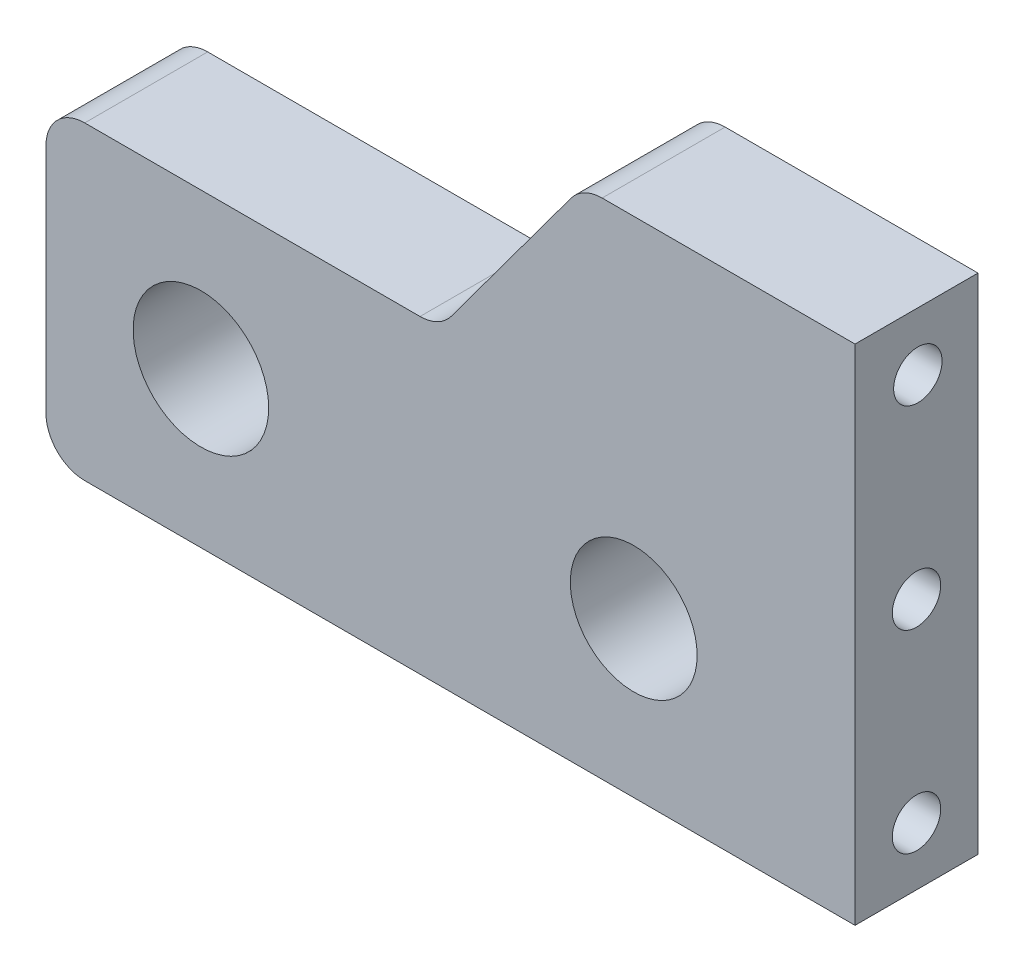
ISO-10303-21;
HEADER;
FILE_DESCRIPTION(('STEP AP214'),'2;1');
FILE_NAME('part.step','',(''),(''),'','','');
FILE_SCHEMA(('AUTOMOTIVE_DESIGN { 1 0 10303 214 1 1 1 1 }'));
ENDSEC;
DATA;
#1=APPLICATION_CONTEXT('core data for automotive mechanical design processes');
#2=APPLICATION_PROTOCOL_DEFINITION('international standard','automotive_design',2000,#1);
#3=PRODUCT_CONTEXT('',#1,'mechanical');
#4=PRODUCT('Part','Part','',(#3));
#5=PRODUCT_RELATED_PRODUCT_CATEGORY('part','',(#4));
#6=PRODUCT_DEFINITION_FORMATION('','',#4);
#7=PRODUCT_DEFINITION_CONTEXT('part definition',#1,'design');
#8=PRODUCT_DEFINITION('design','',#6,#7);
#9=PRODUCT_DEFINITION_SHAPE('','',#8);
#10=(LENGTH_UNIT() NAMED_UNIT(*) SI_UNIT(.MILLI.,.METRE.));
#11=(NAMED_UNIT(*) PLANE_ANGLE_UNIT() SI_UNIT($,.RADIAN.));
#12=(NAMED_UNIT(*) SI_UNIT($,.STERADIAN.) SOLID_ANGLE_UNIT());
#13=UNCERTAINTY_MEASURE_WITH_UNIT(LENGTH_MEASURE(1.E-05),#10,'distance_accuracy_value','');
#14=(GEOMETRIC_REPRESENTATION_CONTEXT(3) GLOBAL_UNCERTAINTY_ASSIGNED_CONTEXT((#13)) GLOBAL_UNIT_ASSIGNED_CONTEXT((#10,
#11,#12)) REPRESENTATION_CONTEXT('',''));
#15=CARTESIAN_POINT('',(0.,0.,0.));
#16=DIRECTION('',(0.,0.,1.));
#17=DIRECTION('',(1.,0.,0.));
#18=AXIS2_PLACEMENT_3D('',#15,#16,#17);
#19=CARTESIAN_POINT('',(0.,0.,6.35));
#20=DIRECTION('',(-1.,0.,0.));
#21=DIRECTION('',(0.,-1.,0.));
#22=AXIS2_PLACEMENT_3D('',#19,#20,#21);
#23=PLANE('',#22);
#24=DIRECTION('',(0.,1.,0.));
#25=VECTOR('',#24,1.);
#26=CARTESIAN_POINT('',(0.,0.,6.35));
#27=LINE('',#26,#25);
#28=CARTESIAN_POINT('',(0.,2.,6.35));
#29=VERTEX_POINT('',#28);
#30=CARTESIAN_POINT('',(0.,14.,6.35));
#31=VERTEX_POINT('',#30);
#32=EDGE_CURVE('E205',#29,#31,#27,.T.);
#33=ORIENTED_EDGE('',*,*,#32,.T.);
#34=DIRECTION('',(0.,0.,-1.));
#35=VECTOR('',#34,1.);
#36=CARTESIAN_POINT('',(0.,14.,6.35));
#37=LINE('',#36,#35);
#38=CARTESIAN_POINT('',(0.,14.,0.));
#39=VERTEX_POINT('',#38);
#40=EDGE_CURVE('E232',#31,#39,#37,.T.);
#41=ORIENTED_EDGE('',*,*,#40,.T.);
#42=DIRECTION('',(0.,1.,0.));
#43=VECTOR('',#42,1.);
#44=CARTESIAN_POINT('',(0.,0.,0.));
#45=LINE('',#44,#43);
#46=CARTESIAN_POINT('',(0.,2.,0.));
#47=VERTEX_POINT('',#46);
#48=EDGE_CURVE('E193',#47,#39,#45,.T.);
#49=ORIENTED_EDGE('',*,*,#48,.F.);
#50=DIRECTION('',(0.,0.,-1.));
#51=VECTOR('',#50,1.);
#52=CARTESIAN_POINT('',(0.,2.,6.35));
#53=LINE('',#52,#51);
#54=EDGE_CURVE('E229',#47,#29,#53,.F.);
#55=ORIENTED_EDGE('',*,*,#54,.T.);
#56=EDGE_LOOP('',(#33,#41,#49,#55));
#57=FACE_BOUND('',#56,.T.);
#58=ADVANCED_FACE('F60',(#57),#23,.T.);
#59=CARTESIAN_POINT('',(0.,0.,6.35));
#60=DIRECTION('',(0.,1.,0.));
#61=DIRECTION('',(-1.,0.,0.));
#62=AXIS2_PLACEMENT_3D('',#59,#60,#61);
#63=PLANE('',#62);
#64=DIRECTION('',(1.,0.,0.));
#65=VECTOR('',#64,1.);
#66=CARTESIAN_POINT('',(0.,0.,6.35));
#67=LINE('',#66,#65);
#68=CARTESIAN_POINT('',(2.,0.,6.35));
#69=VERTEX_POINT('',#68);
#70=CARTESIAN_POINT('',(41.782,0.,6.35));
#71=VERTEX_POINT('',#70);
#72=EDGE_CURVE('E216',#69,#71,#67,.T.);
#73=ORIENTED_EDGE('',*,*,#72,.F.);
#74=DIRECTION('',(0.,0.,-1.));
#75=VECTOR('',#74,1.);
#76=CARTESIAN_POINT('',(2.,0.,0.));
#77=LINE('',#76,#75);
#78=CARTESIAN_POINT('',(2.,0.,0.));
#79=VERTEX_POINT('',#78);
#80=EDGE_CURVE('E251',#69,#79,#77,.T.);
#81=ORIENTED_EDGE('',*,*,#80,.T.);
#82=DIRECTION('',(1.,0.,0.));
#83=VECTOR('',#82,1.);
#84=CARTESIAN_POINT('',(0.,0.,0.));
#85=LINE('',#84,#83);
#86=CARTESIAN_POINT('',(41.782,0.,0.));
#87=VERTEX_POINT('',#86);
#88=EDGE_CURVE('E151',#79,#87,#85,.T.);
#89=ORIENTED_EDGE('',*,*,#88,.T.);
#90=DIRECTION('',(0.,0.,-1.));
#91=VECTOR('',#90,1.);
#92=CARTESIAN_POINT('',(41.782,0.,6.35));
#93=LINE('',#92,#91);
#94=EDGE_CURVE('E148',#71,#87,#93,.T.);
#95=ORIENTED_EDGE('',*,*,#94,.F.);
#96=EDGE_LOOP('',(#73,#81,#89,#95));
#97=FACE_BOUND('',#96,.T.);
#98=ADVANCED_FACE('F311',(#97),#63,.F.);
#99=CARTESIAN_POINT('',(41.782,0.,6.35));
#100=DIRECTION('',(-1.,0.,0.));
#101=DIRECTION('',(0.,0.,1.));
#102=AXIS2_PLACEMENT_3D('',#99,#100,#101);
#103=PLANE('',#102);
#104=CARTESIAN_POINT('',(41.782,23.,3.10572404048079));
#105=DIRECTION('',(1.,0.,0.));
#106=DIRECTION('',(0.,0.,-1.));
#107=AXIS2_PLACEMENT_3D('',#104,#105,#106);
#108=CIRCLE('',#107,1.25);
#109=CARTESIAN_POINT('',(41.782,23.,1.85572404048079));
#110=VERTEX_POINT('',#109);
#111=EDGE_CURVE('E293',#110,#110,#108,.T.);
#112=ORIENTED_EDGE('',*,*,#111,.F.);
#113=EDGE_LOOP('',(#112));
#114=FACE_BOUND('',#113,.T.);
#115=CARTESIAN_POINT('',(41.782,13.,3.175));
#116=DIRECTION('',(1.,0.,0.));
#117=DIRECTION('',(0.,0.,-1.));
#118=AXIS2_PLACEMENT_3D('',#115,#116,#117);
#119=CIRCLE('',#118,1.25);
#120=CARTESIAN_POINT('',(41.782,13.,1.925));
#121=VERTEX_POINT('',#120);
#122=EDGE_CURVE('E176',#121,#121,#119,.T.);
#123=ORIENTED_EDGE('',*,*,#122,.F.);
#124=EDGE_LOOP('',(#123));
#125=FACE_BOUND('',#124,.T.);
#126=CARTESIAN_POINT('',(41.782,3.,3.175));
#127=DIRECTION('',(1.,0.,0.));
#128=DIRECTION('',(0.,0.,-1.));
#129=AXIS2_PLACEMENT_3D('',#126,#127,#128);
#130=CIRCLE('',#129,1.25);
#131=CARTESIAN_POINT('',(41.782,3.,1.925));
#132=VERTEX_POINT('',#131);
#133=EDGE_CURVE('E184',#132,#132,#130,.T.);
#134=ORIENTED_EDGE('',*,*,#133,.F.);
#135=EDGE_LOOP('',(#134));
#136=FACE_BOUND('',#135,.T.);
#137=DIRECTION('',(0.,1.,0.));
#138=VECTOR('',#137,1.);
#139=CARTESIAN_POINT('',(41.782,0.,0.));
#140=LINE('',#139,#138);
#141=CARTESIAN_POINT('',(41.782,26.,0.));
#142=VERTEX_POINT('',#141);
#143=EDGE_CURVE('E141',#87,#142,#140,.T.);
#144=ORIENTED_EDGE('',*,*,#143,.T.);
#145=DIRECTION('',(0.,0.,1.));
#146=VECTOR('',#145,1.);
#147=CARTESIAN_POINT('',(41.782,26.,0.));
#148=LINE('',#147,#146);
#149=CARTESIAN_POINT('',(41.782,26.,6.35));
#150=VERTEX_POINT('',#149);
#151=EDGE_CURVE('E145',#142,#150,#148,.T.);
#152=ORIENTED_EDGE('',*,*,#151,.T.);
#153=DIRECTION('',(0.,1.,0.));
#154=VECTOR('',#153,1.);
#155=CARTESIAN_POINT('',(41.782,0.,6.35));
#156=LINE('',#155,#154);
#157=EDGE_CURVE('E213',#71,#150,#156,.T.);
#158=ORIENTED_EDGE('',*,*,#157,.F.);
#159=ORIENTED_EDGE('',*,*,#94,.T.);
#160=EDGE_LOOP('',(#144,#152,#158,#159));
#161=FACE_BOUND('',#160,.T.);
#162=ADVANCED_FACE('F143',(#114,#125,#136,#161),#103,.F.);
#163=CARTESIAN_POINT('',(0.,16.,6.35));
#164=DIRECTION('',(0.,1.,0.));
#165=DIRECTION('',(-1.,0.,0.));
#166=AXIS2_PLACEMENT_3D('',#163,#164,#165);
#167=PLANE('',#166);
#168=DIRECTION('',(1.,0.,0.));
#169=VECTOR('',#168,1.);
#170=CARTESIAN_POINT('',(0.,16.,6.35));
#171=LINE('',#170,#169);
#172=CARTESIAN_POINT('',(2.00000000000001,16.,6.35));
#173=VERTEX_POINT('',#172);
#174=CARTESIAN_POINT('',(19.3170754387709,16.,6.35));
#175=VERTEX_POINT('',#174);
#176=EDGE_CURVE('E209',#173,#175,#171,.T.);
#177=ORIENTED_EDGE('',*,*,#176,.T.);
#178=DIRECTION('',(0.,0.,1.));
#179=VECTOR('',#178,1.);
#180=CARTESIAN_POINT('',(19.3170754387709,16.,0.));
#181=LINE('',#180,#179);
#182=CARTESIAN_POINT('',(19.3170754387709,16.,0.));
#183=VERTEX_POINT('',#182);
#184=EDGE_CURVE('E262',#175,#183,#181,.F.);
#185=ORIENTED_EDGE('',*,*,#184,.T.);
#186=DIRECTION('',(1.,0.,0.));
#187=VECTOR('',#186,1.);
#188=CARTESIAN_POINT('',(0.,16.,0.));
#189=LINE('',#188,#187);
#190=CARTESIAN_POINT('',(2.00000000000001,16.,0.));
#191=VERTEX_POINT('',#190);
#192=EDGE_CURVE('E152',#191,#183,#189,.T.);
#193=ORIENTED_EDGE('',*,*,#192,.F.);
#194=DIRECTION('',(0.,0.,-1.));
#195=VECTOR('',#194,1.);
#196=CARTESIAN_POINT('',(2.00000000000001,16.,6.35));
#197=LINE('',#196,#195);
#198=EDGE_CURVE('E242',#191,#173,#197,.F.);
#199=ORIENTED_EDGE('',*,*,#198,.T.);
#200=EDGE_LOOP('',(#177,#185,#193,#199));
#201=FACE_BOUND('',#200,.T.);
#202=ADVANCED_FACE('F282',(#201),#167,.T.);
#203=CARTESIAN_POINT('',(0.,0.,6.35));
#204=DIRECTION('',(0.,0.,-1.));
#205=DIRECTION('',(-1.,0.,0.));
#206=AXIS2_PLACEMENT_3D('',#203,#204,#205);
#207=PLANE('',#206);
#208=CARTESIAN_POINT('',(8.,8.,6.35));
#209=DIRECTION('',(0.,0.,1.));
#210=DIRECTION('',(1.,0.,0.));
#211=AXIS2_PLACEMENT_3D('',#208,#209,#210);
#212=CIRCLE('',#211,3.5);
#213=CARTESIAN_POINT('',(11.5,8.,6.35));
#214=VERTEX_POINT('',#213);
#215=EDGE_CURVE('E189',#214,#214,#212,.T.);
#216=ORIENTED_EDGE('',*,*,#215,.F.);
#217=EDGE_LOOP('',(#216));
#218=FACE_BOUND('',#217,.T.);
#219=CARTESIAN_POINT('',(30.352,8.,6.35));
#220=DIRECTION('',(0.,0.,1.));
#221=DIRECTION('',(1.,0.,0.));
#222=AXIS2_PLACEMENT_3D('',#219,#220,#221);
#223=CIRCLE('',#222,3.275);
#224=CARTESIAN_POINT('',(33.627,8.,6.35));
#225=VERTEX_POINT('',#224);
#226=EDGE_CURVE('E175',#225,#225,#223,.T.);
#227=ORIENTED_EDGE('',*,*,#226,.F.);
#228=EDGE_LOOP('',(#227));
#229=FACE_BOUND('',#228,.T.);
#230=DIRECTION('',(-1.,0.,0.));
#231=VECTOR('',#230,1.);
#232=CARTESIAN_POINT('',(41.782,26.,6.35));
#233=LINE('',#232,#231);
#234=CARTESIAN_POINT('',(28.7212493815809,26.,6.35));
#235=VERTEX_POINT('',#234);
#236=EDGE_CURVE('E158',#150,#235,#233,.T.);
#237=ORIENTED_EDGE('',*,*,#236,.T.);
#238=CARTESIAN_POINT('',(28.7212493815809,24.,6.35));
#239=DIRECTION('',(0.,0.,-1.));
#240=DIRECTION('',(-1.,0.,0.));
#241=AXIS2_PLACEMENT_3D('',#238,#239,#240);
#242=CIRCLE('',#241,2.);
#243=CARTESIAN_POINT('',(27.112470955428,25.1882053591636,6.35));
#244=VERTEX_POINT('',#243);
#245=EDGE_CURVE('E84',#235,#244,#242,.F.);
#246=ORIENTED_EDGE('',*,*,#245,.T.);
#247=DIRECTION('',(-0.594102679581803,-0.804389213076432,0.));
#248=VECTOR('',#247,1.);
#249=CARTESIAN_POINT('',(5.50572150582795,-4.06639453447363,6.35));
#250=LINE('',#249,#248);
#251=CARTESIAN_POINT('',(20.9258538649237,16.8117946408364,6.35));
#252=VERTEX_POINT('',#251);
#253=EDGE_CURVE('E160',#244,#252,#250,.T.);
#254=ORIENTED_EDGE('',*,*,#253,.T.);
#255=CARTESIAN_POINT('',(19.3170754387709,18.,6.35));
#256=DIRECTION('',(0.,0.,-1.));
#257=DIRECTION('',(-1.,0.,0.));
#258=AXIS2_PLACEMENT_3D('',#255,#256,#257);
#259=CIRCLE('',#258,2.);
#260=EDGE_CURVE('E69',#252,#175,#259,.T.);
#261=ORIENTED_EDGE('',*,*,#260,.T.);
#262=ORIENTED_EDGE('',*,*,#176,.F.);
#263=CARTESIAN_POINT('',(2.,14.,6.35));
#264=DIRECTION('',(0.,0.,-1.));
#265=DIRECTION('',(-1.,0.,0.));
#266=AXIS2_PLACEMENT_3D('',#263,#264,#265);
#267=CIRCLE('',#266,2.);
#268=EDGE_CURVE('E248',#173,#31,#267,.F.);
#269=ORIENTED_EDGE('',*,*,#268,.T.);
#270=ORIENTED_EDGE('',*,*,#32,.F.);
#271=CARTESIAN_POINT('',(2.,2.,6.35));
#272=DIRECTION('',(0.,0.,-1.));
#273=DIRECTION('',(-1.,0.,0.));
#274=AXIS2_PLACEMENT_3D('',#271,#272,#273);
#275=CIRCLE('',#274,2.);
#276=EDGE_CURVE('E245',#29,#69,#275,.F.);
#277=ORIENTED_EDGE('',*,*,#276,.T.);
#278=ORIENTED_EDGE('',*,*,#72,.T.);
#279=ORIENTED_EDGE('',*,*,#157,.T.);
#280=EDGE_LOOP('',(#237,#246,#254,#261,#262,#269,#270,#277,#278,#279));
#281=FACE_BOUND('',#280,.T.);
#282=ADVANCED_FACE('F275',(#218,#229,#281),#207,.F.);
#283=CARTESIAN_POINT('',(0.,0.,0.));
#284=DIRECTION('',(0.,0.,-1.));
#285=DIRECTION('',(-1.,0.,0.));
#286=AXIS2_PLACEMENT_3D('',#283,#284,#285);
#287=PLANE('',#286);
#288=CARTESIAN_POINT('',(8.,8.,0.));
#289=DIRECTION('',(0.,0.,1.));
#290=DIRECTION('',(1.,0.,0.));
#291=AXIS2_PLACEMENT_3D('',#288,#289,#290);
#292=CIRCLE('',#291,3.5);
#293=CARTESIAN_POINT('',(11.5,8.,0.));
#294=VERTEX_POINT('',#293);
#295=EDGE_CURVE('E194',#294,#294,#292,.T.);
#296=ORIENTED_EDGE('',*,*,#295,.T.);
#297=EDGE_LOOP('',(#296));
#298=FACE_BOUND('',#297,.T.);
#299=CARTESIAN_POINT('',(30.352,8.,0.));
#300=DIRECTION('',(0.,0.,1.));
#301=DIRECTION('',(1.,0.,0.));
#302=AXIS2_PLACEMENT_3D('',#299,#300,#301);
#303=CIRCLE('',#302,3.275);
#304=CARTESIAN_POINT('',(33.627,8.,0.));
#305=VERTEX_POINT('',#304);
#306=EDGE_CURVE('E198',#305,#305,#303,.T.);
#307=ORIENTED_EDGE('',*,*,#306,.T.);
#308=EDGE_LOOP('',(#307));
#309=FACE_BOUND('',#308,.T.);
#310=DIRECTION('',(-0.594102679581803,-0.804389213076432,0.));
#311=VECTOR('',#310,1.);
#312=CARTESIAN_POINT('',(5.50572150582795,-4.06639453447363,0.));
#313=LINE('',#312,#311);
#314=CARTESIAN_POINT('',(27.112470955428,25.1882053591636,0.));
#315=VERTEX_POINT('',#314);
#316=CARTESIAN_POINT('',(20.9258538649237,16.8117946408364,0.));
#317=VERTEX_POINT('',#316);
#318=EDGE_CURVE('E188',#315,#317,#313,.T.);
#319=ORIENTED_EDGE('',*,*,#318,.F.);
#320=CARTESIAN_POINT('',(28.7212493815809,24.,0.));
#321=DIRECTION('',(0.,0.,-1.));
#322=DIRECTION('',(-1.,0.,0.));
#323=AXIS2_PLACEMENT_3D('',#320,#321,#322);
#324=CIRCLE('',#323,2.);
#325=CARTESIAN_POINT('',(28.7212493815809,26.,0.));
#326=VERTEX_POINT('',#325);
#327=EDGE_CURVE('E76',#315,#326,#324,.T.);
#328=ORIENTED_EDGE('',*,*,#327,.T.);
#329=DIRECTION('',(-1.,0.,0.));
#330=VECTOR('',#329,1.);
#331=CARTESIAN_POINT('',(41.782,26.,0.));
#332=LINE('',#331,#330);
#333=EDGE_CURVE('E156',#142,#326,#332,.T.);
#334=ORIENTED_EDGE('',*,*,#333,.F.);
#335=ORIENTED_EDGE('',*,*,#143,.F.);
#336=ORIENTED_EDGE('',*,*,#88,.F.);
#337=CARTESIAN_POINT('',(2.,2.,0.));
#338=DIRECTION('',(0.,0.,-1.));
#339=DIRECTION('',(-1.,0.,0.));
#340=AXIS2_PLACEMENT_3D('',#337,#338,#339);
#341=CIRCLE('',#340,2.);
#342=EDGE_CURVE('E236',#79,#47,#341,.T.);
#343=ORIENTED_EDGE('',*,*,#342,.T.);
#344=ORIENTED_EDGE('',*,*,#48,.T.);
#345=CARTESIAN_POINT('',(2.,14.,0.));
#346=DIRECTION('',(0.,0.,-1.));
#347=DIRECTION('',(-1.,0.,0.));
#348=AXIS2_PLACEMENT_3D('',#345,#346,#347);
#349=CIRCLE('',#348,2.);
#350=EDGE_CURVE('E239',#39,#191,#349,.T.);
#351=ORIENTED_EDGE('',*,*,#350,.T.);
#352=ORIENTED_EDGE('',*,*,#192,.T.);
#353=CARTESIAN_POINT('',(19.3170754387709,18.,0.));
#354=DIRECTION('',(0.,0.,-1.));
#355=DIRECTION('',(-1.,0.,0.));
#356=AXIS2_PLACEMENT_3D('',#353,#354,#355);
#357=CIRCLE('',#356,2.);
#358=EDGE_CURVE('E12',#183,#317,#357,.F.);
#359=ORIENTED_EDGE('',*,*,#358,.T.);
#360=EDGE_LOOP('',(#319,#328,#334,#335,#336,#343,#344,#351,#352,#359));
#361=FACE_BOUND('',#360,.T.);
#362=ADVANCED_FACE('F162',(#298,#309,#361),#287,.T.);
#363=CARTESIAN_POINT('',(30.352,8.,6.35));
#364=DIRECTION('',(0.,0.,-1.));
#365=DIRECTION('',(-1.,0.,0.));
#366=AXIS2_PLACEMENT_3D('',#363,#364,#365);
#367=CYLINDRICAL_SURFACE('',#366,3.275);
#368=ORIENTED_EDGE('',*,*,#226,.T.);
#369=EDGE_LOOP('',(#368));
#370=FACE_BOUND('',#369,.T.);
#371=ORIENTED_EDGE('',*,*,#306,.F.);
#372=EDGE_LOOP('',(#371));
#373=FACE_BOUND('',#372,.T.);
#374=ADVANCED_FACE('F395',(#370,#373),#367,.F.);
#375=CARTESIAN_POINT('',(8.,8.,6.35));
#376=DIRECTION('',(0.,0.,-1.));
#377=DIRECTION('',(-1.,0.,0.));
#378=AXIS2_PLACEMENT_3D('',#375,#376,#377);
#379=CYLINDRICAL_SURFACE('',#378,3.5);
#380=ORIENTED_EDGE('',*,*,#215,.T.);
#381=EDGE_LOOP('',(#380));
#382=FACE_BOUND('',#381,.T.);
#383=ORIENTED_EDGE('',*,*,#295,.F.);
#384=EDGE_LOOP('',(#383));
#385=FACE_BOUND('',#384,.T.);
#386=ADVANCED_FACE('F346',(#382,#385),#379,.F.);
#387=CARTESIAN_POINT('',(2.,14.,6.35));
#388=DIRECTION('',(0.,0.,-1.));
#389=DIRECTION('',(-1.,0.,0.));
#390=AXIS2_PLACEMENT_3D('',#387,#388,#389);
#391=CYLINDRICAL_SURFACE('',#390,2.);
#392=ORIENTED_EDGE('',*,*,#268,.F.);
#393=ORIENTED_EDGE('',*,*,#198,.F.);
#394=ORIENTED_EDGE('',*,*,#350,.F.);
#395=ORIENTED_EDGE('',*,*,#40,.F.);
#396=EDGE_LOOP('',(#392,#393,#394,#395));
#397=FACE_BOUND('',#396,.T.);
#398=ADVANCED_FACE('F330',(#397),#391,.T.);
#399=CARTESIAN_POINT('',(2.,2.,6.35));
#400=DIRECTION('',(0.,0.,1.));
#401=DIRECTION('',(1.,0.,0.));
#402=AXIS2_PLACEMENT_3D('',#399,#400,#401);
#403=CYLINDRICAL_SURFACE('',#402,2.);
#404=ORIENTED_EDGE('',*,*,#276,.F.);
#405=ORIENTED_EDGE('',*,*,#54,.F.);
#406=ORIENTED_EDGE('',*,*,#342,.F.);
#407=ORIENTED_EDGE('',*,*,#80,.F.);
#408=EDGE_LOOP('',(#404,#405,#406,#407));
#409=FACE_BOUND('',#408,.T.);
#410=ADVANCED_FACE('F320',(#409),#403,.T.);
#411=CARTESIAN_POINT('',(37.782,3.,3.175));
#412=DIRECTION('',(1.,0.,0.));
#413=DIRECTION('',(0.,0.,-1.));
#414=AXIS2_PLACEMENT_3D('',#411,#412,#413);
#415=CYLINDRICAL_SURFACE('',#414,1.25);
#416=CARTESIAN_POINT('',(37.782,3.,3.175));
#417=DIRECTION('',(1.,0.,0.));
#418=DIRECTION('',(0.,0.,-1.));
#419=AXIS2_PLACEMENT_3D('',#416,#417,#418);
#420=CIRCLE('',#419,1.25);
#421=CARTESIAN_POINT('',(37.782,3.,1.925));
#422=VERTEX_POINT('',#421);
#423=EDGE_CURVE('E180',#422,#422,#420,.T.);
#424=ORIENTED_EDGE('',*,*,#423,.F.);
#425=EDGE_LOOP('',(#424));
#426=FACE_BOUND('',#425,.T.);
#427=ORIENTED_EDGE('',*,*,#133,.T.);
#428=EDGE_LOOP('',(#427));
#429=FACE_BOUND('',#428,.T.);
#430=ADVANCED_FACE('F317',(#426,#429),#415,.F.);
#431=CARTESIAN_POINT('',(37.782,3.,3.175));
#432=DIRECTION('',(1.,0.,0.));
#433=DIRECTION('',(0.,0.,-1.));
#434=AXIS2_PLACEMENT_3D('',#431,#432,#433);
#435=PLANE('',#434);
#436=ORIENTED_EDGE('',*,*,#423,.T.);
#437=EDGE_LOOP('',(#436));
#438=FACE_BOUND('',#437,.T.);
#439=ADVANCED_FACE('F319',(#438),#435,.T.);
#440=CARTESIAN_POINT('',(37.782,13.,3.175));
#441=DIRECTION('',(1.,0.,0.));
#442=DIRECTION('',(0.,0.,-1.));
#443=AXIS2_PLACEMENT_3D('',#440,#441,#442);
#444=CYLINDRICAL_SURFACE('',#443,1.25);
#445=CARTESIAN_POINT('',(37.782,13.,3.175));
#446=DIRECTION('',(1.,0.,0.));
#447=DIRECTION('',(0.,0.,-1.));
#448=AXIS2_PLACEMENT_3D('',#445,#446,#447);
#449=CIRCLE('',#448,1.25);
#450=CARTESIAN_POINT('',(37.782,13.,1.925));
#451=VERTEX_POINT('',#450);
#452=EDGE_CURVE('E171',#451,#451,#449,.T.);
#453=ORIENTED_EDGE('',*,*,#452,.F.);
#454=EDGE_LOOP('',(#453));
#455=FACE_BOUND('',#454,.T.);
#456=ORIENTED_EDGE('',*,*,#122,.T.);
#457=EDGE_LOOP('',(#456));
#458=FACE_BOUND('',#457,.T.);
#459=ADVANCED_FACE('F327',(#455,#458),#444,.F.);
#460=CARTESIAN_POINT('',(37.782,13.,3.175));
#461=DIRECTION('',(1.,0.,0.));
#462=DIRECTION('',(0.,0.,-1.));
#463=AXIS2_PLACEMENT_3D('',#460,#461,#462);
#464=PLANE('',#463);
#465=ORIENTED_EDGE('',*,*,#452,.T.);
#466=EDGE_LOOP('',(#465));
#467=FACE_BOUND('',#466,.T.);
#468=ADVANCED_FACE('F354',(#467),#464,.T.);
#469=CARTESIAN_POINT('',(5.50572150582795,-4.06639453447363,0.));
#470=DIRECTION('',(-0.804389213076432,0.594102679581803,0.));
#471=DIRECTION('',(-0.594102679581803,-0.804389213076432,0.));
#472=AXIS2_PLACEMENT_3D('',#469,#470,#471);
#473=PLANE('',#472);
#474=ORIENTED_EDGE('',*,*,#318,.T.);
#475=DIRECTION('',(0.,0.,1.));
#476=VECTOR('',#475,1.);
#477=CARTESIAN_POINT('',(20.9258538649237,16.8117946408364,6.35));
#478=LINE('',#477,#476);
#479=EDGE_CURVE('E258',#317,#252,#478,.T.);
#480=ORIENTED_EDGE('',*,*,#479,.T.);
#481=ORIENTED_EDGE('',*,*,#253,.F.);
#482=DIRECTION('',(0.,0.,1.));
#483=VECTOR('',#482,1.);
#484=CARTESIAN_POINT('',(27.112470955428,25.1882053591636,0.));
#485=LINE('',#484,#483);
#486=EDGE_CURVE('E255',#244,#315,#485,.F.);
#487=ORIENTED_EDGE('',*,*,#486,.T.);
#488=EDGE_LOOP('',(#474,#480,#481,#487));
#489=FACE_BOUND('',#488,.T.);
#490=ADVANCED_FACE('F289',(#489),#473,.T.);
#491=CARTESIAN_POINT('',(41.782,26.,0.));
#492=DIRECTION('',(0.,1.,0.));
#493=DIRECTION('',(0.,0.,1.));
#494=AXIS2_PLACEMENT_3D('',#491,#492,#493);
#495=PLANE('',#494);
#496=ORIENTED_EDGE('',*,*,#333,.T.);
#497=DIRECTION('',(0.,0.,1.));
#498=VECTOR('',#497,1.);
#499=CARTESIAN_POINT('',(28.7212493815809,26.,0.));
#500=LINE('',#499,#498);
#501=EDGE_CURVE('E265',#326,#235,#500,.T.);
#502=ORIENTED_EDGE('',*,*,#501,.T.);
#503=ORIENTED_EDGE('',*,*,#236,.F.);
#504=ORIENTED_EDGE('',*,*,#151,.F.);
#505=EDGE_LOOP('',(#496,#502,#503,#504));
#506=FACE_BOUND('',#505,.T.);
#507=ADVANCED_FACE('F155',(#506),#495,.T.);
#508=CARTESIAN_POINT('',(19.3170754387709,18.,0.));
#509=DIRECTION('',(0.,0.,-1.));
#510=DIRECTION('',(-1.,0.,0.));
#511=AXIS2_PLACEMENT_3D('',#508,#509,#510);
#512=CYLINDRICAL_SURFACE('',#511,2.);
#513=ORIENTED_EDGE('',*,*,#358,.F.);
#514=ORIENTED_EDGE('',*,*,#184,.F.);
#515=ORIENTED_EDGE('',*,*,#260,.F.);
#516=ORIENTED_EDGE('',*,*,#479,.F.);
#517=EDGE_LOOP('',(#513,#514,#515,#516));
#518=FACE_BOUND('',#517,.T.);
#519=ADVANCED_FACE('F286',(#518),#512,.F.);
#520=CARTESIAN_POINT('',(28.7212493815809,24.,0.));
#521=DIRECTION('',(0.,0.,1.));
#522=DIRECTION('',(1.,0.,0.));
#523=AXIS2_PLACEMENT_3D('',#520,#521,#522);
#524=CYLINDRICAL_SURFACE('',#523,2.);
#525=ORIENTED_EDGE('',*,*,#327,.F.);
#526=ORIENTED_EDGE('',*,*,#486,.F.);
#527=ORIENTED_EDGE('',*,*,#245,.F.);
#528=ORIENTED_EDGE('',*,*,#501,.F.);
#529=EDGE_LOOP('',(#525,#526,#527,#528));
#530=FACE_BOUND('',#529,.T.);
#531=ADVANCED_FACE('F62',(#530),#524,.T.);
#532=CARTESIAN_POINT('',(37.782,23.,3.10572404048079));
#533=DIRECTION('',(1.,0.,0.));
#534=DIRECTION('',(0.,0.,-1.));
#535=AXIS2_PLACEMENT_3D('',#532,#533,#534);
#536=CYLINDRICAL_SURFACE('',#535,1.25);
#537=CARTESIAN_POINT('',(37.782,23.,3.10572404048079));
#538=DIRECTION('',(1.,0.,0.));
#539=DIRECTION('',(0.,0.,-1.));
#540=AXIS2_PLACEMENT_3D('',#537,#538,#539);
#541=CIRCLE('',#540,1.25);
#542=CARTESIAN_POINT('',(37.782,23.,1.85572404048079));
#543=VERTEX_POINT('',#542);
#544=EDGE_CURVE('E166',#543,#543,#541,.T.);
#545=ORIENTED_EDGE('',*,*,#544,.F.);
#546=EDGE_LOOP('',(#545));
#547=FACE_BOUND('',#546,.T.);
#548=ORIENTED_EDGE('',*,*,#111,.T.);
#549=EDGE_LOOP('',(#548));
#550=FACE_BOUND('',#549,.T.);
#551=ADVANCED_FACE('F303',(#547,#550),#536,.F.);
#552=CARTESIAN_POINT('',(37.782,23.,3.10572404048079));
#553=DIRECTION('',(1.,0.,0.));
#554=DIRECTION('',(0.,0.,-1.));
#555=AXIS2_PLACEMENT_3D('',#552,#553,#554);
#556=PLANE('',#555);
#557=ORIENTED_EDGE('',*,*,#544,.T.);
#558=EDGE_LOOP('',(#557));
#559=FACE_BOUND('',#558,.T.);
#560=ADVANCED_FACE('F301',(#559),#556,.T.);
#561=CLOSED_SHELL('',(#58,#98,#162,#202,#282,#362,#374,#386,#398,#410,#430,#439,#459,#468,#490,
#507,#519,#531,#551,#560));
#562=MANIFOLD_SOLID_BREP('B2',#561);
#563=ADVANCED_BREP_SHAPE_REPRESENTATION('',(#18,#562),#14);
#564=SHAPE_DEFINITION_REPRESENTATION(#9,#563);
ENDSEC;
END-ISO-10303-21;
